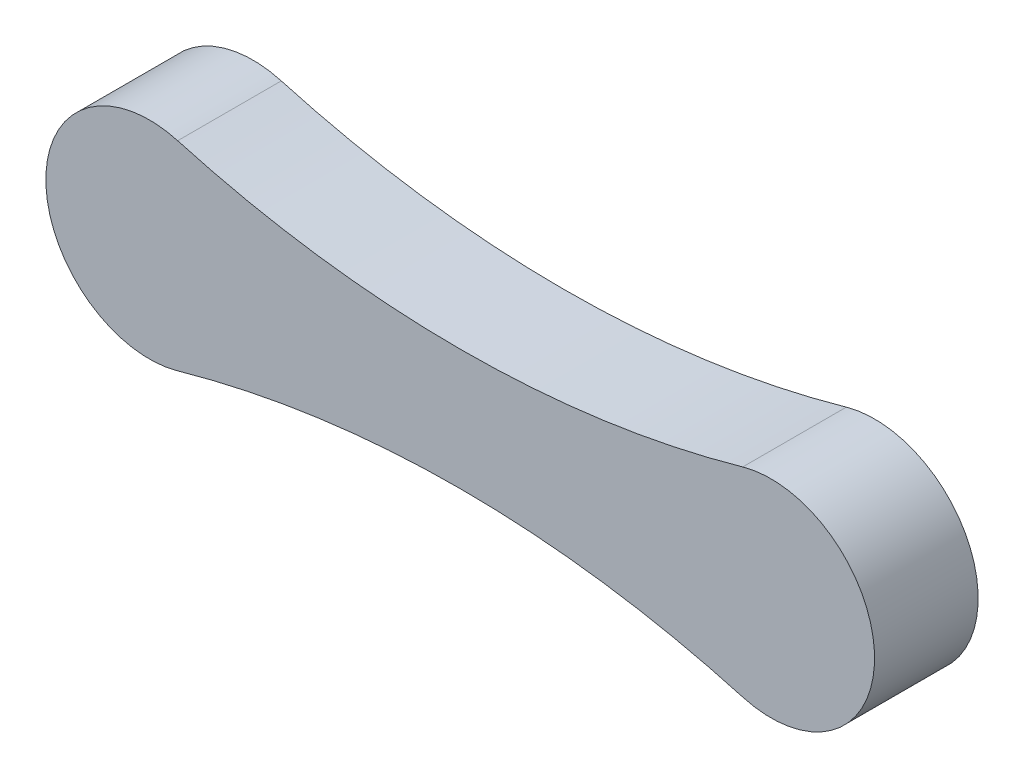
ISO-10303-21;
HEADER;
FILE_DESCRIPTION(('STEP AP214'),'2;1');
FILE_NAME('part.step','',(''),(''),'','','');
FILE_SCHEMA(('AUTOMOTIVE_DESIGN { 1 0 10303 214 1 1 1 1 }'));
ENDSEC;
DATA;
#1=APPLICATION_CONTEXT('core data for automotive mechanical design processes');
#2=APPLICATION_PROTOCOL_DEFINITION('international standard','automotive_design',2000,#1);
#3=PRODUCT_CONTEXT('',#1,'mechanical');
#4=PRODUCT('Part','Part','',(#3));
#5=PRODUCT_RELATED_PRODUCT_CATEGORY('part','',(#4));
#6=PRODUCT_DEFINITION_FORMATION('','',#4);
#7=PRODUCT_DEFINITION_CONTEXT('part definition',#1,'design');
#8=PRODUCT_DEFINITION('design','',#6,#7);
#9=PRODUCT_DEFINITION_SHAPE('','',#8);
#10=(LENGTH_UNIT() NAMED_UNIT(*) SI_UNIT(.MILLI.,.METRE.));
#11=(NAMED_UNIT(*) PLANE_ANGLE_UNIT() SI_UNIT($,.RADIAN.));
#12=(NAMED_UNIT(*) SI_UNIT($,.STERADIAN.) SOLID_ANGLE_UNIT());
#13=UNCERTAINTY_MEASURE_WITH_UNIT(LENGTH_MEASURE(1.E-05),#10,'distance_accuracy_value','');
#14=(GEOMETRIC_REPRESENTATION_CONTEXT(3) GLOBAL_UNCERTAINTY_ASSIGNED_CONTEXT((#13)) GLOBAL_UNIT_ASSIGNED_CONTEXT((#10,
#11,#12)) REPRESENTATION_CONTEXT('',''));
#15=CARTESIAN_POINT('',(0.,0.,0.));
#16=DIRECTION('',(0.,0.,1.));
#17=DIRECTION('',(1.,0.,0.));
#18=AXIS2_PLACEMENT_3D('',#15,#16,#17);
#19=CARTESIAN_POINT('',(0.,0.,0.));
#20=DIRECTION('',(0.,0.,1.));
#21=DIRECTION('',(1.,0.,0.));
#22=AXIS2_PLACEMENT_3D('',#19,#20,#21);
#23=PLANE('',#22);
#24=CARTESIAN_POINT('',(30.,0.,0.));
#25=DIRECTION('',(0.,0.,1.));
#26=DIRECTION('',(1.,0.,0.));
#27=AXIS2_PLACEMENT_3D('',#24,#25,#26);
#28=CIRCLE('',#27,5.);
#29=CARTESIAN_POINT('',(28.6363636363636,-4.81045692920835,0.));
#30=VERTEX_POINT('',#29);
#31=CARTESIAN_POINT('',(28.6363636363636,4.81045692920835,0.));
#32=VERTEX_POINT('',#31);
#33=EDGE_CURVE('E105',#30,#32,#28,.T.);
#34=ORIENTED_EDGE('',*,*,#33,.F.);
#35=CARTESIAN_POINT('',(15.,-52.9150262212918,0.));
#36=DIRECTION('',(0.,0.,1.));
#37=DIRECTION('',(1.,0.,0.));
#38=AXIS2_PLACEMENT_3D('',#35,#36,#37);
#39=CIRCLE('',#38,50.);
#40=CARTESIAN_POINT('',(1.36363636363636,-4.81045692920835,0.));
#41=VERTEX_POINT('',#40);
#42=EDGE_CURVE('E124',#41,#30,#39,.F.);
#43=ORIENTED_EDGE('',*,*,#42,.F.);
#44=CARTESIAN_POINT('',(0.,0.,0.));
#45=DIRECTION('',(0.,0.,1.));
#46=DIRECTION('',(1.,0.,0.));
#47=AXIS2_PLACEMENT_3D('',#44,#45,#46);
#48=CIRCLE('',#47,5.);
#49=CARTESIAN_POINT('',(1.36363636363636,4.81045692920835,0.));
#50=VERTEX_POINT('',#49);
#51=EDGE_CURVE('E90',#50,#41,#48,.T.);
#52=ORIENTED_EDGE('',*,*,#51,.F.);
#53=CARTESIAN_POINT('',(15.,52.9150262212918,0.));
#54=DIRECTION('',(0.,0.,1.));
#55=DIRECTION('',(1.,0.,0.));
#56=AXIS2_PLACEMENT_3D('',#53,#54,#55);
#57=CIRCLE('',#56,50.);
#58=EDGE_CURVE('E129',#50,#32,#57,.T.);
#59=ORIENTED_EDGE('',*,*,#58,.T.);
#60=EDGE_LOOP('',(#34,#43,#52,#59));
#61=FACE_BOUND('',#60,.T.);
#62=ADVANCED_FACE('F54',(#61),#23,.F.);
#63=CARTESIAN_POINT('',(30.,0.,5.));
#64=DIRECTION('',(0.,0.,-1.));
#65=DIRECTION('',(-1.,0.,0.));
#66=AXIS2_PLACEMENT_3D('',#63,#64,#65);
#67=CYLINDRICAL_SURFACE('',#66,5.);
#68=ORIENTED_EDGE('',*,*,#33,.T.);
#69=DIRECTION('',(0.,0.,-1.));
#70=VECTOR('',#69,1.);
#71=CARTESIAN_POINT('',(28.6363636363636,4.81045692920835,5.));
#72=LINE('',#71,#70);
#73=CARTESIAN_POINT('',(28.6363636363636,4.81045692920835,5.));
#74=VERTEX_POINT('',#73);
#75=EDGE_CURVE('E64',#74,#32,#72,.T.);
#76=ORIENTED_EDGE('',*,*,#75,.F.);
#77=CARTESIAN_POINT('',(30.,0.,5.));
#78=DIRECTION('',(0.,0.,1.));
#79=DIRECTION('',(1.,0.,0.));
#80=AXIS2_PLACEMENT_3D('',#77,#78,#79);
#81=CIRCLE('',#80,5.);
#82=CARTESIAN_POINT('',(28.6363636363636,-4.81045692920835,5.));
#83=VERTEX_POINT('',#82);
#84=EDGE_CURVE('E103',#83,#74,#81,.T.);
#85=ORIENTED_EDGE('',*,*,#84,.F.);
#86=DIRECTION('',(0.,0.,-1.));
#87=VECTOR('',#86,1.);
#88=CARTESIAN_POINT('',(28.6363636363636,-4.81045692920835,5.));
#89=LINE('',#88,#87);
#90=EDGE_CURVE('E12',#83,#30,#89,.T.);
#91=ORIENTED_EDGE('',*,*,#90,.T.);
#92=EDGE_LOOP('',(#68,#76,#85,#91));
#93=FACE_BOUND('',#92,.T.);
#94=ADVANCED_FACE('F102',(#93),#67,.T.);
#95=CARTESIAN_POINT('',(0.,0.,5.));
#96=DIRECTION('',(0.,0.,1.));
#97=DIRECTION('',(1.,0.,0.));
#98=AXIS2_PLACEMENT_3D('',#95,#96,#97);
#99=PLANE('',#98);
#100=ORIENTED_EDGE('',*,*,#84,.T.);
#101=CARTESIAN_POINT('',(15.,52.9150262212918,5.));
#102=DIRECTION('',(0.,0.,1.));
#103=DIRECTION('',(1.,0.,0.));
#104=AXIS2_PLACEMENT_3D('',#101,#102,#103);
#105=CIRCLE('',#104,50.);
#106=CARTESIAN_POINT('',(1.36363636363636,4.81045692920835,5.));
#107=VERTEX_POINT('',#106);
#108=EDGE_CURVE('E112',#107,#74,#105,.T.);
#109=ORIENTED_EDGE('',*,*,#108,.F.);
#110=CARTESIAN_POINT('',(0.,0.,5.));
#111=DIRECTION('',(0.,0.,1.));
#112=DIRECTION('',(1.,0.,0.));
#113=AXIS2_PLACEMENT_3D('',#110,#111,#112);
#114=CIRCLE('',#113,5.);
#115=CARTESIAN_POINT('',(1.36363636363636,-4.81045692920835,5.));
#116=VERTEX_POINT('',#115);
#117=EDGE_CURVE('E72',#107,#116,#114,.T.);
#118=ORIENTED_EDGE('',*,*,#117,.T.);
#119=CARTESIAN_POINT('',(15.,-52.9150262212918,5.));
#120=DIRECTION('',(0.,0.,1.));
#121=DIRECTION('',(1.,0.,0.));
#122=AXIS2_PLACEMENT_3D('',#119,#120,#121);
#123=CIRCLE('',#122,50.);
#124=EDGE_CURVE('E113',#116,#83,#123,.F.);
#125=ORIENTED_EDGE('',*,*,#124,.T.);
#126=EDGE_LOOP('',(#100,#109,#118,#125));
#127=FACE_BOUND('',#126,.T.);
#128=ADVANCED_FACE('F111',(#127),#99,.T.);
#129=CARTESIAN_POINT('',(15.,52.9150262212918,5.));
#130=DIRECTION('',(0.,0.,-1.));
#131=DIRECTION('',(-1.,0.,0.));
#132=AXIS2_PLACEMENT_3D('',#129,#130,#131);
#133=CYLINDRICAL_SURFACE('',#132,50.);
#134=ORIENTED_EDGE('',*,*,#58,.F.);
#135=DIRECTION('',(0.,0.,-1.));
#136=VECTOR('',#135,1.);
#137=CARTESIAN_POINT('',(1.36363636363636,4.81045692920835,5.));
#138=LINE('',#137,#136);
#139=EDGE_CURVE('E87',#107,#50,#138,.T.);
#140=ORIENTED_EDGE('',*,*,#139,.F.);
#141=ORIENTED_EDGE('',*,*,#108,.T.);
#142=ORIENTED_EDGE('',*,*,#75,.T.);
#143=EDGE_LOOP('',(#134,#140,#141,#142));
#144=FACE_BOUND('',#143,.T.);
#145=ADVANCED_FACE('F116',(#144),#133,.F.);
#146=CARTESIAN_POINT('',(0.,0.,5.));
#147=DIRECTION('',(0.,0.,-1.));
#148=DIRECTION('',(-1.,0.,0.));
#149=AXIS2_PLACEMENT_3D('',#146,#147,#148);
#150=CYLINDRICAL_SURFACE('',#149,5.);
#151=ORIENTED_EDGE('',*,*,#51,.T.);
#152=DIRECTION('',(0.,0.,-1.));
#153=VECTOR('',#152,1.);
#154=CARTESIAN_POINT('',(1.36363636363636,-4.81045692920835,5.));
#155=LINE('',#154,#153);
#156=EDGE_CURVE('E120',#116,#41,#155,.T.);
#157=ORIENTED_EDGE('',*,*,#156,.F.);
#158=ORIENTED_EDGE('',*,*,#117,.F.);
#159=ORIENTED_EDGE('',*,*,#139,.T.);
#160=EDGE_LOOP('',(#151,#157,#158,#159));
#161=FACE_BOUND('',#160,.T.);
#162=ADVANCED_FACE('F147',(#161),#150,.T.);
#163=CARTESIAN_POINT('',(15.,-52.9150262212918,5.));
#164=DIRECTION('',(0.,0.,-1.));
#165=DIRECTION('',(-1.,0.,0.));
#166=AXIS2_PLACEMENT_3D('',#163,#164,#165);
#167=CYLINDRICAL_SURFACE('',#166,50.);
#168=ORIENTED_EDGE('',*,*,#42,.T.);
#169=ORIENTED_EDGE('',*,*,#90,.F.);
#170=ORIENTED_EDGE('',*,*,#124,.F.);
#171=ORIENTED_EDGE('',*,*,#156,.T.);
#172=EDGE_LOOP('',(#168,#169,#170,#171));
#173=FACE_BOUND('',#172,.T.);
#174=ADVANCED_FACE('F56',(#173),#167,.F.);
#175=CLOSED_SHELL('',(#62,#94,#128,#145,#162,#174));
#176=MANIFOLD_SOLID_BREP('B2',#175);
#177=ADVANCED_BREP_SHAPE_REPRESENTATION('',(#18,#176),#14);
#178=SHAPE_DEFINITION_REPRESENTATION(#9,#177);
ENDSEC;
END-ISO-10303-21;
